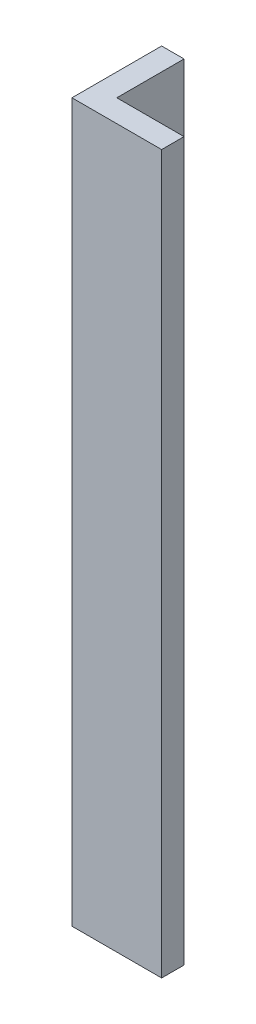
ISO-10303-21;
HEADER;
FILE_DESCRIPTION(('STEP AP214'),'2;1');
FILE_NAME('part.step','',(''),(''),'','','');
FILE_SCHEMA(('AUTOMOTIVE_DESIGN { 1 0 10303 214 1 1 1 1 }'));
ENDSEC;
DATA;
#1=APPLICATION_CONTEXT('core data for automotive mechanical design processes');
#2=APPLICATION_PROTOCOL_DEFINITION('international standard','automotive_design',2000,#1);
#3=PRODUCT_CONTEXT('',#1,'mechanical');
#4=PRODUCT('Part','Part','',(#3));
#5=PRODUCT_RELATED_PRODUCT_CATEGORY('part','',(#4));
#6=PRODUCT_DEFINITION_FORMATION('','',#4);
#7=PRODUCT_DEFINITION_CONTEXT('part definition',#1,'design');
#8=PRODUCT_DEFINITION('design','',#6,#7);
#9=PRODUCT_DEFINITION_SHAPE('','',#8);
#10=(LENGTH_UNIT() NAMED_UNIT(*) SI_UNIT(.MILLI.,.METRE.));
#11=(NAMED_UNIT(*) PLANE_ANGLE_UNIT() SI_UNIT($,.RADIAN.));
#12=(NAMED_UNIT(*) SI_UNIT($,.STERADIAN.) SOLID_ANGLE_UNIT());
#13=UNCERTAINTY_MEASURE_WITH_UNIT(LENGTH_MEASURE(1.E-05),#10,'distance_accuracy_value','');
#14=(GEOMETRIC_REPRESENTATION_CONTEXT(3) GLOBAL_UNCERTAINTY_ASSIGNED_CONTEXT((#13)) GLOBAL_UNIT_ASSIGNED_CONTEXT((#10,
#11,#12)) REPRESENTATION_CONTEXT('',''));
#15=CARTESIAN_POINT('',(0.,0.,0.));
#16=DIRECTION('',(0.,0.,1.));
#17=DIRECTION('',(1.,0.,0.));
#18=AXIS2_PLACEMENT_3D('',#15,#16,#17);
#19=CARTESIAN_POINT('',(0.,50.8,0.));
#20=DIRECTION('',(1.,0.,0.));
#21=DIRECTION('',(0.,0.,-1.));
#22=AXIS2_PLACEMENT_3D('',#19,#20,#21);
#23=PLANE('',#22);
#24=DIRECTION('',(0.,0.,1.));
#25=VECTOR('',#24,1.);
#26=CARTESIAN_POINT('',(0.,0.,0.));
#27=LINE('',#26,#25);
#28=CARTESIAN_POINT('',(0.,0.,-6.35));
#29=VERTEX_POINT('',#28);
#30=CARTESIAN_POINT('',(0.,0.,0.));
#31=VERTEX_POINT('',#30);
#32=EDGE_CURVE('E117',#29,#31,#27,.T.);
#33=ORIENTED_EDGE('',*,*,#32,.T.);
#34=DIRECTION('',(0.,-1.,0.));
#35=VECTOR('',#34,1.);
#36=CARTESIAN_POINT('',(0.,50.8,0.));
#37=LINE('',#36,#35);
#38=CARTESIAN_POINT('',(0.,50.8,0.));
#39=VERTEX_POINT('',#38);
#40=EDGE_CURVE('E11',#39,#31,#37,.T.);
#41=ORIENTED_EDGE('',*,*,#40,.F.);
#42=DIRECTION('',(0.,0.,1.));
#43=VECTOR('',#42,1.);
#44=CARTESIAN_POINT('',(0.,50.8,0.));
#45=LINE('',#44,#43);
#46=CARTESIAN_POINT('',(0.,50.8,-6.35));
#47=VERTEX_POINT('',#46);
#48=EDGE_CURVE('E127',#47,#39,#45,.T.);
#49=ORIENTED_EDGE('',*,*,#48,.F.);
#50=DIRECTION('',(0.,-1.,0.));
#51=VECTOR('',#50,1.);
#52=CARTESIAN_POINT('',(0.,50.8,-6.35));
#53=LINE('',#52,#51);
#54=EDGE_CURVE('E113',#47,#29,#53,.T.);
#55=ORIENTED_EDGE('',*,*,#54,.T.);
#56=EDGE_LOOP('',(#33,#41,#49,#55));
#57=FACE_BOUND('',#56,.T.);
#58=ADVANCED_FACE('F33',(#57),#23,.F.);
#59=CARTESIAN_POINT('',(0.,50.8,0.));
#60=DIRECTION('',(0.,0.,-1.));
#61=DIRECTION('',(-1.,0.,0.));
#62=AXIS2_PLACEMENT_3D('',#59,#60,#61);
#63=PLANE('',#62);
#64=DIRECTION('',(1.,0.,0.));
#65=VECTOR('',#64,1.);
#66=CARTESIAN_POINT('',(0.,0.,0.));
#67=LINE('',#66,#65);
#68=CARTESIAN_POINT('',(6.35,0.,0.));
#69=VERTEX_POINT('',#68);
#70=EDGE_CURVE('E120',#31,#69,#67,.T.);
#71=ORIENTED_EDGE('',*,*,#70,.T.);
#72=DIRECTION('',(0.,-1.,0.));
#73=VECTOR('',#72,1.);
#74=CARTESIAN_POINT('',(6.35,50.8,0.));
#75=LINE('',#74,#73);
#76=CARTESIAN_POINT('',(6.35,50.8,0.));
#77=VERTEX_POINT('',#76);
#78=EDGE_CURVE('E41',#77,#69,#75,.T.);
#79=ORIENTED_EDGE('',*,*,#78,.F.);
#80=DIRECTION('',(1.,0.,0.));
#81=VECTOR('',#80,1.);
#82=CARTESIAN_POINT('',(0.,50.8,0.));
#83=LINE('',#82,#81);
#84=EDGE_CURVE('E86',#39,#77,#83,.T.);
#85=ORIENTED_EDGE('',*,*,#84,.F.);
#86=ORIENTED_EDGE('',*,*,#40,.T.);
#87=EDGE_LOOP('',(#71,#79,#85,#86));
#88=FACE_BOUND('',#87,.T.);
#89=ADVANCED_FACE('F151',(#88),#63,.F.);
#90=CARTESIAN_POINT('',(6.35,50.8,0.));
#91=DIRECTION('',(-1.,0.,0.));
#92=DIRECTION('',(0.,0.,1.));
#93=AXIS2_PLACEMENT_3D('',#90,#91,#92);
#94=PLANE('',#93);
#95=DIRECTION('',(0.,0.,-1.));
#96=VECTOR('',#95,1.);
#97=CARTESIAN_POINT('',(6.35,0.,0.));
#98=LINE('',#97,#96);
#99=CARTESIAN_POINT('',(6.35,0.,-1.5875));
#100=VERTEX_POINT('',#99);
#101=EDGE_CURVE('E122',#69,#100,#98,.T.);
#102=ORIENTED_EDGE('',*,*,#101,.T.);
#103=DIRECTION('',(0.,-1.,0.));
#104=VECTOR('',#103,1.);
#105=CARTESIAN_POINT('',(6.35,50.8,-1.5875));
#106=LINE('',#105,#104);
#107=CARTESIAN_POINT('',(6.35,50.8,-1.5875));
#108=VERTEX_POINT('',#107);
#109=EDGE_CURVE('E108',#108,#100,#106,.T.);
#110=ORIENTED_EDGE('',*,*,#109,.F.);
#111=DIRECTION('',(0.,0.,-1.));
#112=VECTOR('',#111,1.);
#113=CARTESIAN_POINT('',(6.35,50.8,0.));
#114=LINE('',#113,#112);
#115=EDGE_CURVE('E99',#77,#108,#114,.T.);
#116=ORIENTED_EDGE('',*,*,#115,.F.);
#117=ORIENTED_EDGE('',*,*,#78,.T.);
#118=EDGE_LOOP('',(#102,#110,#116,#117));
#119=FACE_BOUND('',#118,.T.);
#120=ADVANCED_FACE('F133',(#119),#94,.F.);
#121=CARTESIAN_POINT('',(6.35,50.8,-1.5875));
#122=DIRECTION('',(0.,0.,1.));
#123=DIRECTION('',(1.,0.,0.));
#124=AXIS2_PLACEMENT_3D('',#121,#122,#123);
#125=PLANE('',#124);
#126=DIRECTION('',(-1.,0.,0.));
#127=VECTOR('',#126,1.);
#128=CARTESIAN_POINT('',(6.35,0.,-1.5875));
#129=LINE('',#128,#127);
#130=CARTESIAN_POINT('',(1.5875,0.,-1.5875));
#131=VERTEX_POINT('',#130);
#132=EDGE_CURVE('E107',#100,#131,#129,.T.);
#133=ORIENTED_EDGE('',*,*,#132,.T.);
#134=DIRECTION('',(0.,-1.,0.));
#135=VECTOR('',#134,1.);
#136=CARTESIAN_POINT('',(1.5875,50.8,-1.5875));
#137=LINE('',#136,#135);
#138=CARTESIAN_POINT('',(1.5875,50.8,-1.5875));
#139=VERTEX_POINT('',#138);
#140=EDGE_CURVE('E104',#139,#131,#137,.T.);
#141=ORIENTED_EDGE('',*,*,#140,.F.);
#142=DIRECTION('',(-1.,0.,0.));
#143=VECTOR('',#142,1.);
#144=CARTESIAN_POINT('',(6.35,50.8,-1.5875));
#145=LINE('',#144,#143);
#146=EDGE_CURVE('E93',#108,#139,#145,.T.);
#147=ORIENTED_EDGE('',*,*,#146,.F.);
#148=ORIENTED_EDGE('',*,*,#109,.T.);
#149=EDGE_LOOP('',(#133,#141,#147,#148));
#150=FACE_BOUND('',#149,.T.);
#151=ADVANCED_FACE('F105',(#150),#125,.F.);
#152=CARTESIAN_POINT('',(1.5875,50.8,-6.35));
#153=DIRECTION('',(-1.,0.,0.));
#154=DIRECTION('',(0.,0.,1.));
#155=AXIS2_PLACEMENT_3D('',#152,#153,#154);
#156=PLANE('',#155);
#157=DIRECTION('',(0.,0.,-1.));
#158=VECTOR('',#157,1.);
#159=CARTESIAN_POINT('',(1.5875,0.,-6.35));
#160=LINE('',#159,#158);
#161=CARTESIAN_POINT('',(1.5875,0.,-6.35));
#162=VERTEX_POINT('',#161);
#163=EDGE_CURVE('E72',#131,#162,#160,.T.);
#164=ORIENTED_EDGE('',*,*,#163,.T.);
#165=DIRECTION('',(0.,-1.,0.));
#166=VECTOR('',#165,1.);
#167=CARTESIAN_POINT('',(1.5875,50.8,-6.35));
#168=LINE('',#167,#166);
#169=CARTESIAN_POINT('',(1.5875,50.8,-6.35));
#170=VERTEX_POINT('',#169);
#171=EDGE_CURVE('E109',#170,#162,#168,.T.);
#172=ORIENTED_EDGE('',*,*,#171,.F.);
#173=DIRECTION('',(0.,0.,-1.));
#174=VECTOR('',#173,1.);
#175=CARTESIAN_POINT('',(1.5875,50.8,-6.35));
#176=LINE('',#175,#174);
#177=EDGE_CURVE('E97',#139,#170,#176,.T.);
#178=ORIENTED_EDGE('',*,*,#177,.F.);
#179=ORIENTED_EDGE('',*,*,#140,.T.);
#180=EDGE_LOOP('',(#164,#172,#178,#179));
#181=FACE_BOUND('',#180,.T.);
#182=ADVANCED_FACE('F111',(#181),#156,.F.);
#183=CARTESIAN_POINT('',(0.,50.8,-6.35));
#184=DIRECTION('',(0.,0.,1.));
#185=DIRECTION('',(1.,0.,0.));
#186=AXIS2_PLACEMENT_3D('',#183,#184,#185);
#187=PLANE('',#186);
#188=DIRECTION('',(-1.,0.,0.));
#189=VECTOR('',#188,1.);
#190=CARTESIAN_POINT('',(0.,0.,-6.35));
#191=LINE('',#190,#189);
#192=EDGE_CURVE('E78',#162,#29,#191,.T.);
#193=ORIENTED_EDGE('',*,*,#192,.T.);
#194=ORIENTED_EDGE('',*,*,#54,.F.);
#195=DIRECTION('',(-1.,0.,0.));
#196=VECTOR('',#195,1.);
#197=CARTESIAN_POINT('',(0.,50.8,-6.35));
#198=LINE('',#197,#196);
#199=EDGE_CURVE('E49',#170,#47,#198,.T.);
#200=ORIENTED_EDGE('',*,*,#199,.F.);
#201=ORIENTED_EDGE('',*,*,#171,.T.);
#202=EDGE_LOOP('',(#193,#194,#200,#201));
#203=FACE_BOUND('',#202,.T.);
#204=ADVANCED_FACE('F140',(#203),#187,.F.);
#205=CARTESIAN_POINT('',(0.,50.8,0.));
#206=DIRECTION('',(0.,-1.,0.));
#207=DIRECTION('',(0.,0.,-1.));
#208=AXIS2_PLACEMENT_3D('',#205,#206,#207);
#209=PLANE('',#208);
#210=ORIENTED_EDGE('',*,*,#48,.T.);
#211=ORIENTED_EDGE('',*,*,#84,.T.);
#212=ORIENTED_EDGE('',*,*,#115,.T.);
#213=ORIENTED_EDGE('',*,*,#146,.T.);
#214=ORIENTED_EDGE('',*,*,#177,.T.);
#215=ORIENTED_EDGE('',*,*,#199,.T.);
#216=EDGE_LOOP('',(#210,#211,#212,#213,#214,#215));
#217=FACE_BOUND('',#216,.T.);
#218=ADVANCED_FACE('F95',(#217),#209,.F.);
#219=CARTESIAN_POINT('',(0.,0.,0.));
#220=DIRECTION('',(0.,-1.,0.));
#221=DIRECTION('',(0.,0.,-1.));
#222=AXIS2_PLACEMENT_3D('',#219,#220,#221);
#223=PLANE('',#222);
#224=ORIENTED_EDGE('',*,*,#32,.F.);
#225=ORIENTED_EDGE('',*,*,#192,.F.);
#226=ORIENTED_EDGE('',*,*,#163,.F.);
#227=ORIENTED_EDGE('',*,*,#132,.F.);
#228=ORIENTED_EDGE('',*,*,#101,.F.);
#229=ORIENTED_EDGE('',*,*,#70,.F.);
#230=EDGE_LOOP('',(#224,#225,#226,#227,#228,#229));
#231=FACE_BOUND('',#230,.T.);
#232=ADVANCED_FACE('F136',(#231),#223,.T.);
#233=CLOSED_SHELL('',(#58,#89,#120,#151,#182,#204,#218,#232));
#234=MANIFOLD_SOLID_BREP('B2',#233);
#235=ADVANCED_BREP_SHAPE_REPRESENTATION('',(#18,#234),#14);
#236=SHAPE_DEFINITION_REPRESENTATION(#9,#235);
ENDSEC;
END-ISO-10303-21;
